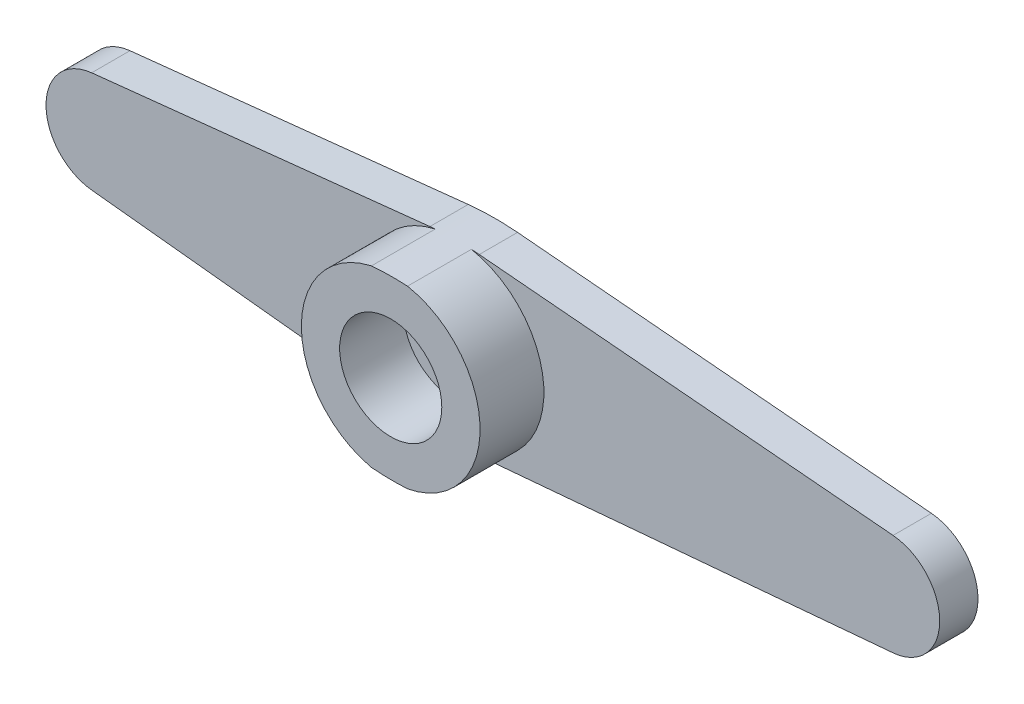
ISO-10303-21;
HEADER;
FILE_DESCRIPTION(('STEP AP214'),'2;1');
FILE_NAME('part.step','',(''),(''),'','','');
FILE_SCHEMA(('AUTOMOTIVE_DESIGN { 1 0 10303 214 1 1 1 1 }'));
ENDSEC;
DATA;
#1=APPLICATION_CONTEXT('core data for automotive mechanical design processes');
#2=APPLICATION_PROTOCOL_DEFINITION('international standard','automotive_design',2000,#1);
#3=PRODUCT_CONTEXT('',#1,'mechanical');
#4=PRODUCT('Part','Part','',(#3));
#5=PRODUCT_RELATED_PRODUCT_CATEGORY('part','',(#4));
#6=PRODUCT_DEFINITION_FORMATION('','',#4);
#7=PRODUCT_DEFINITION_CONTEXT('part definition',#1,'design');
#8=PRODUCT_DEFINITION('design','',#6,#7);
#9=PRODUCT_DEFINITION_SHAPE('','',#8);
#10=(LENGTH_UNIT() NAMED_UNIT(*) SI_UNIT(.MILLI.,.METRE.));
#11=(NAMED_UNIT(*) PLANE_ANGLE_UNIT() SI_UNIT($,.RADIAN.));
#12=(NAMED_UNIT(*) SI_UNIT($,.STERADIAN.) SOLID_ANGLE_UNIT());
#13=UNCERTAINTY_MEASURE_WITH_UNIT(LENGTH_MEASURE(1.E-05),#10,'distance_accuracy_value','');
#14=(GEOMETRIC_REPRESENTATION_CONTEXT(3) GLOBAL_UNCERTAINTY_ASSIGNED_CONTEXT((#13)) GLOBAL_UNIT_ASSIGNED_CONTEXT((#10,
#11,#12)) REPRESENTATION_CONTEXT('',''));
#15=CARTESIAN_POINT('',(0.,0.,0.));
#16=DIRECTION('',(0.,0.,1.));
#17=DIRECTION('',(1.,0.,0.));
#18=AXIS2_PLACEMENT_3D('',#15,#16,#17);
#19=CARTESIAN_POINT('',(0.0923349657358031,6.54656065875096,1.5));
#20=DIRECTION('',(0.,0.,1.));
#21=DIRECTION('',(1.,0.,0.));
#22=AXIS2_PLACEMENT_3D('',#19,#20,#21);
#23=PLANE('',#22);
#24=CARTESIAN_POINT('',(0.0923349657358031,6.54656065875096,1.5));
#25=DIRECTION('',(0.,0.,1.));
#26=DIRECTION('',(1.,0.,0.));
#27=AXIS2_PLACEMENT_3D('',#24,#25,#26);
#28=CIRCLE('',#27,10.);
#29=CARTESIAN_POINT('',(-0.965077795265276,-3.3973760995391,1.5));
#30=VERTEX_POINT('',#29);
#31=CARTESIAN_POINT('',(-0.755897231967521,-3.41739950469708,1.5));
#32=VERTEX_POINT('',#31);
#33=EDGE_CURVE('E270',#30,#32,#28,.T.);
#34=ORIENTED_EDGE('',*,*,#33,.T.);
#35=CARTESIAN_POINT('',(0.,0.,1.5));
#36=DIRECTION('',(0.,0.,1.));
#37=DIRECTION('',(1.,0.,0.));
#38=AXIS2_PLACEMENT_3D('',#35,#36,#37);
#39=CIRCLE('',#38,3.5);
#40=CARTESIAN_POINT('',(-0.755897231967522,3.41739950469708,1.5));
#41=VERTEX_POINT('',#40);
#42=EDGE_CURVE('E162',#32,#41,#39,.F.);
#43=ORIENTED_EDGE('',*,*,#42,.T.);
#44=CARTESIAN_POINT('',(0.0923349657358066,-6.54656065875096,1.5));
#45=DIRECTION('',(0.,0.,1.));
#46=DIRECTION('',(1.,0.,0.));
#47=AXIS2_PLACEMENT_3D('',#44,#45,#46);
#48=CIRCLE('',#47,10.);
#49=CARTESIAN_POINT('',(-0.965077795265283,3.3973760995391,1.5));
#50=VERTEX_POINT('',#49);
#51=EDGE_CURVE('E131',#41,#50,#48,.T.);
#52=ORIENTED_EDGE('',*,*,#51,.T.);
#53=DIRECTION('',(-0.994393675829005,-0.105741276100109,0.));
#54=VECTOR('',#53,1.);
#55=CARTESIAN_POINT('',(-0.965077795265282,3.39737609953909,1.5));
#56=LINE('',#55,#54);
#57=CARTESIAN_POINT('',(-14.2114825522002,1.988787351658,1.5));
#58=VERTEX_POINT('',#57);
#59=EDGE_CURVE('E122',#50,#58,#56,.T.);
#60=ORIENTED_EDGE('',*,*,#59,.T.);
#61=CARTESIAN_POINT('',(-14.,0.,1.5));
#62=DIRECTION('',(0.,0.,1.));
#63=DIRECTION('',(1.,0.,0.));
#64=AXIS2_PLACEMENT_3D('',#61,#62,#63);
#65=CIRCLE('',#64,2.);
#66=CARTESIAN_POINT('',(-14.2114825522002,-1.98878735165802,1.5));
#67=VERTEX_POINT('',#66);
#68=EDGE_CURVE('E127',#58,#67,#65,.T.);
#69=ORIENTED_EDGE('',*,*,#68,.T.);
#70=DIRECTION('',(-0.994393675829005,0.105741276100108,0.));
#71=VECTOR('',#70,1.);
#72=CARTESIAN_POINT('',(-0.965077795265276,-3.3973760995391,1.5));
#73=LINE('',#72,#71);
#74=EDGE_CURVE('E152',#30,#67,#73,.T.);
#75=ORIENTED_EDGE('',*,*,#74,.F.);
#76=EDGE_LOOP('',(#34,#43,#52,#60,#69,#75));
#77=FACE_BOUND('',#76,.T.);
#78=ADVANCED_FACE('F41',(#77),#23,.T.);
#79=CARTESIAN_POINT('',(0.0923349657358031,6.54656065875096,1.5));
#80=DIRECTION('',(0.,0.,-1.));
#81=DIRECTION('',(-1.,0.,0.));
#82=AXIS2_PLACEMENT_3D('',#79,#80,#81);
#83=CYLINDRICAL_SURFACE('',#82,10.);
#84=CARTESIAN_POINT('',(0.0923349657358031,6.54656065875096,0.));
#85=DIRECTION('',(0.,0.,1.));
#86=DIRECTION('',(1.,0.,0.));
#87=AXIS2_PLACEMENT_3D('',#84,#85,#86);
#88=CIRCLE('',#87,10.);
#89=CARTESIAN_POINT('',(-0.965077795265276,-3.3973760995391,0.));
#90=VERTEX_POINT('',#89);
#91=CARTESIAN_POINT('',(0.966800983112841,-3.41513142565181,0.));
#92=VERTEX_POINT('',#91);
#93=EDGE_CURVE('E158',#90,#92,#88,.T.);
#94=ORIENTED_EDGE('',*,*,#93,.T.);
#95=DIRECTION('',(0.,0.,-1.));
#96=VECTOR('',#95,1.);
#97=CARTESIAN_POINT('',(0.966800983112841,-3.41513142565181,1.5));
#98=LINE('',#97,#96);
#99=CARTESIAN_POINT('',(0.966800983112841,-3.41513142565181,1.5));
#100=VERTEX_POINT('',#99);
#101=EDGE_CURVE('E45',#100,#92,#98,.T.);
#102=ORIENTED_EDGE('',*,*,#101,.F.);
#103=CARTESIAN_POINT('',(0.659215340358419,-3.43735874401205,1.5));
#104=VERTEX_POINT('',#103);
#105=EDGE_CURVE('E105',#104,#100,#28,.T.);
#106=ORIENTED_EDGE('',*,*,#105,.F.);
#107=DIRECTION('',(0.,0.,-1.));
#108=VECTOR('',#107,1.);
#109=CARTESIAN_POINT('',(0.659215340358419,-3.43735874401205,4.));
#110=LINE('',#109,#108);
#111=CARTESIAN_POINT('',(0.659215340358419,-3.43735874401205,4.));
#112=VERTEX_POINT('',#111);
#113=EDGE_CURVE('E58',#112,#104,#110,.T.);
#114=ORIENTED_EDGE('',*,*,#113,.F.);
#115=CARTESIAN_POINT('',(0.0923349657358031,6.54656065875096,4.));
#116=DIRECTION('',(0.,0.,1.));
#117=DIRECTION('',(1.,0.,0.));
#118=AXIS2_PLACEMENT_3D('',#115,#116,#117);
#119=CIRCLE('',#118,10.);
#120=CARTESIAN_POINT('',(-0.755897231967521,-3.41739950469708,4.));
#121=VERTEX_POINT('',#120);
#122=EDGE_CURVE('E254',#121,#112,#119,.T.);
#123=ORIENTED_EDGE('',*,*,#122,.F.);
#124=DIRECTION('',(0.,0.,-1.));
#125=VECTOR('',#124,1.);
#126=CARTESIAN_POINT('',(-0.755897231967521,-3.41739950469708,4.));
#127=LINE('',#126,#125);
#128=EDGE_CURVE('E251',#121,#32,#127,.T.);
#129=ORIENTED_EDGE('',*,*,#128,.T.);
#130=ORIENTED_EDGE('',*,*,#33,.F.);
#131=DIRECTION('',(0.,0.,-1.));
#132=VECTOR('',#131,1.);
#133=CARTESIAN_POINT('',(-0.965077795265276,-3.3973760995391,1.5));
#134=LINE('',#133,#132);
#135=EDGE_CURVE('E67',#30,#90,#134,.T.);
#136=ORIENTED_EDGE('',*,*,#135,.T.);
#137=EDGE_LOOP('',(#94,#102,#106,#114,#123,#129,#130,#136));
#138=FACE_BOUND('',#137,.T.);
#139=ADVANCED_FACE('F43',(#138),#83,.T.);
#140=CARTESIAN_POINT('',(0.966800983112841,-3.41513142565181,1.5));
#141=DIRECTION('',(-0.0874466017377038,0.996169208440277,0.));
#142=DIRECTION('',(-0.996169208440277,-0.0874466017377038,0.));
#143=AXIS2_PLACEMENT_3D('',#140,#141,#142);
#144=PLANE('',#143);
#145=DIRECTION('',(0.996169208440277,0.0874466017377038,0.));
#146=VECTOR('',#145,1.);
#147=CARTESIAN_POINT('',(0.966800983112841,-3.41513142565181,0.));
#148=LINE('',#147,#146);
#149=CARTESIAN_POINT('',(17.1748932034754,-1.99233841688056,0.));
#150=VERTEX_POINT('',#149);
#151=EDGE_CURVE('E161',#92,#150,#148,.T.);
#152=ORIENTED_EDGE('',*,*,#151,.T.);
#153=DIRECTION('',(0.,0.,-1.));
#154=VECTOR('',#153,1.);
#155=CARTESIAN_POINT('',(17.1748932034754,-1.99233841688056,1.5));
#156=LINE('',#155,#154);
#157=CARTESIAN_POINT('',(17.1748932034754,-1.99233841688056,1.5));
#158=VERTEX_POINT('',#157);
#159=EDGE_CURVE('E197',#158,#150,#156,.T.);
#160=ORIENTED_EDGE('',*,*,#159,.F.);
#161=DIRECTION('',(0.996169208440277,0.0874466017377038,0.));
#162=VECTOR('',#161,1.);
#163=CARTESIAN_POINT('',(0.966800983112841,-3.41513142565181,1.5));
#164=LINE('',#163,#162);
#165=EDGE_CURVE('E209',#100,#158,#164,.T.);
#166=ORIENTED_EDGE('',*,*,#165,.F.);
#167=ORIENTED_EDGE('',*,*,#101,.T.);
#168=EDGE_LOOP('',(#152,#160,#166,#167));
#169=FACE_BOUND('',#168,.T.);
#170=ADVANCED_FACE('F207',(#169),#144,.F.);
#171=CARTESIAN_POINT('',(17.,0.,1.5));
#172=DIRECTION('',(0.,0.,-1.));
#173=DIRECTION('',(-1.,0.,0.));
#174=AXIS2_PLACEMENT_3D('',#171,#172,#173);
#175=CYLINDRICAL_SURFACE('',#174,2.);
#176=CARTESIAN_POINT('',(17.,0.,0.));
#177=DIRECTION('',(0.,0.,-1.));
#178=DIRECTION('',(-1.,0.,0.));
#179=AXIS2_PLACEMENT_3D('',#176,#177,#178);
#180=CIRCLE('',#179,2.);
#181=CARTESIAN_POINT('',(17.1748932034754,1.99233841688055,0.));
#182=VERTEX_POINT('',#181);
#183=EDGE_CURVE('E166',#182,#150,#180,.T.);
#184=ORIENTED_EDGE('',*,*,#183,.F.);
#185=DIRECTION('',(0.,0.,-1.));
#186=VECTOR('',#185,1.);
#187=CARTESIAN_POINT('',(17.1748932034754,1.99233841688055,1.5));
#188=LINE('',#187,#186);
#189=CARTESIAN_POINT('',(17.1748932034754,1.99233841688055,1.5));
#190=VERTEX_POINT('',#189);
#191=EDGE_CURVE('E195',#190,#182,#188,.T.);
#192=ORIENTED_EDGE('',*,*,#191,.F.);
#193=CARTESIAN_POINT('',(17.,0.,1.5));
#194=DIRECTION('',(0.,0.,-1.));
#195=DIRECTION('',(-1.,0.,0.));
#196=AXIS2_PLACEMENT_3D('',#193,#194,#195);
#197=CIRCLE('',#196,2.);
#198=EDGE_CURVE('E216',#190,#158,#197,.T.);
#199=ORIENTED_EDGE('',*,*,#198,.T.);
#200=ORIENTED_EDGE('',*,*,#159,.T.);
#201=EDGE_LOOP('',(#184,#192,#199,#200));
#202=FACE_BOUND('',#201,.T.);
#203=ADVANCED_FACE('F214',(#202),#175,.T.);
#204=CARTESIAN_POINT('',(0.966800983112849,3.41513142565181,1.5));
#205=DIRECTION('',(0.0874466017377044,0.996169208440277,0.));
#206=DIRECTION('',(-0.996169208440277,0.0874466017377044,0.));
#207=AXIS2_PLACEMENT_3D('',#204,#205,#206);
#208=PLANE('',#207);
#209=DIRECTION('',(0.996169208440277,-0.0874466017377044,0.));
#210=VECTOR('',#209,1.);
#211=CARTESIAN_POINT('',(0.966800983112849,3.41513142565181,0.));
#212=LINE('',#211,#210);
#213=CARTESIAN_POINT('',(0.966800983112849,3.41513142565181,0.));
#214=VERTEX_POINT('',#213);
#215=EDGE_CURVE('E170',#214,#182,#212,.T.);
#216=ORIENTED_EDGE('',*,*,#215,.F.);
#217=DIRECTION('',(0.,0.,-1.));
#218=VECTOR('',#217,1.);
#219=CARTESIAN_POINT('',(0.966800983112849,3.41513142565181,1.5));
#220=LINE('',#219,#218);
#221=CARTESIAN_POINT('',(0.966800983112849,3.41513142565181,1.5));
#222=VERTEX_POINT('',#221);
#223=EDGE_CURVE('E192',#222,#214,#220,.T.);
#224=ORIENTED_EDGE('',*,*,#223,.F.);
#225=DIRECTION('',(0.996169208440277,-0.0874466017377044,0.));
#226=VECTOR('',#225,1.);
#227=CARTESIAN_POINT('',(0.966800983112849,3.41513142565181,1.5));
#228=LINE('',#227,#226);
#229=EDGE_CURVE('E222',#222,#190,#228,.T.);
#230=ORIENTED_EDGE('',*,*,#229,.T.);
#231=ORIENTED_EDGE('',*,*,#191,.T.);
#232=EDGE_LOOP('',(#216,#224,#230,#231));
#233=FACE_BOUND('',#232,.T.);
#234=ADVANCED_FACE('F225',(#233),#208,.T.);
#235=CARTESIAN_POINT('',(0.0923349657358066,-6.54656065875096,1.5));
#236=DIRECTION('',(0.,0.,-1.));
#237=DIRECTION('',(-1.,0.,0.));
#238=AXIS2_PLACEMENT_3D('',#235,#236,#237);
#239=CYLINDRICAL_SURFACE('',#238,10.);
#240=CARTESIAN_POINT('',(0.0923349657358066,-6.54656065875096,0.));
#241=DIRECTION('',(0.,0.,1.));
#242=DIRECTION('',(1.,0.,0.));
#243=AXIS2_PLACEMENT_3D('',#240,#241,#242);
#244=CIRCLE('',#243,10.);
#245=CARTESIAN_POINT('',(-0.965077795265283,3.3973760995391,0.));
#246=VERTEX_POINT('',#245);
#247=EDGE_CURVE('E174',#214,#246,#244,.T.);
#248=ORIENTED_EDGE('',*,*,#247,.T.);
#249=DIRECTION('',(0.,0.,-1.));
#250=VECTOR('',#249,1.);
#251=CARTESIAN_POINT('',(-0.965077795265283,3.3973760995391,1.5));
#252=LINE('',#251,#250);
#253=EDGE_CURVE('E147',#50,#246,#252,.T.);
#254=ORIENTED_EDGE('',*,*,#253,.F.);
#255=ORIENTED_EDGE('',*,*,#51,.F.);
#256=DIRECTION('',(0.,0.,-1.));
#257=VECTOR('',#256,1.);
#258=CARTESIAN_POINT('',(-0.755897231967522,3.41739950469708,4.));
#259=LINE('',#258,#257);
#260=CARTESIAN_POINT('',(-0.755897231967522,3.41739950469708,4.));
#261=VERTEX_POINT('',#260);
#262=EDGE_CURVE('E262',#261,#41,#259,.T.);
#263=ORIENTED_EDGE('',*,*,#262,.F.);
#264=CARTESIAN_POINT('',(0.0923349657358066,-6.54656065875096,4.));
#265=DIRECTION('',(0.,0.,1.));
#266=DIRECTION('',(1.,0.,0.));
#267=AXIS2_PLACEMENT_3D('',#264,#265,#266);
#268=CIRCLE('',#267,10.);
#269=CARTESIAN_POINT('',(0.659215340358417,3.43735874401205,4.));
#270=VERTEX_POINT('',#269);
#271=EDGE_CURVE('E245',#270,#261,#268,.T.);
#272=ORIENTED_EDGE('',*,*,#271,.F.);
#273=DIRECTION('',(0.,0.,-1.));
#274=VECTOR('',#273,1.);
#275=CARTESIAN_POINT('',(0.659215340358417,3.43735874401205,4.));
#276=LINE('',#275,#274);
#277=CARTESIAN_POINT('',(0.659215340358417,3.43735874401205,1.5));
#278=VERTEX_POINT('',#277);
#279=EDGE_CURVE('E242',#270,#278,#276,.T.);
#280=ORIENTED_EDGE('',*,*,#279,.T.);
#281=EDGE_CURVE('E136',#222,#278,#48,.T.);
#282=ORIENTED_EDGE('',*,*,#281,.F.);
#283=ORIENTED_EDGE('',*,*,#223,.T.);
#284=EDGE_LOOP('',(#248,#254,#255,#263,#272,#280,#282,#283));
#285=FACE_BOUND('',#284,.T.);
#286=ADVANCED_FACE('F239',(#285),#239,.T.);
#287=CARTESIAN_POINT('',(-0.965077795265282,3.39737609953909,1.5));
#288=DIRECTION('',(0.105741276100109,-0.994393675829005,0.));
#289=DIRECTION('',(0.994393675829005,0.105741276100109,0.));
#290=AXIS2_PLACEMENT_3D('',#287,#288,#289);
#291=PLANE('',#290);
#292=DIRECTION('',(-0.994393675829005,-0.105741276100109,0.));
#293=VECTOR('',#292,1.);
#294=CARTESIAN_POINT('',(-0.965077795265282,3.39737609953909,0.));
#295=LINE('',#294,#293);
#296=CARTESIAN_POINT('',(-14.2114825522002,1.988787351658,0.));
#297=VERTEX_POINT('',#296);
#298=EDGE_CURVE('E142',#246,#297,#295,.T.);
#299=ORIENTED_EDGE('',*,*,#298,.T.);
#300=DIRECTION('',(0.,0.,-1.));
#301=VECTOR('',#300,1.);
#302=CARTESIAN_POINT('',(-14.2114825522002,1.988787351658,1.5));
#303=LINE('',#302,#301);
#304=EDGE_CURVE('E139',#58,#297,#303,.T.);
#305=ORIENTED_EDGE('',*,*,#304,.F.);
#306=ORIENTED_EDGE('',*,*,#59,.F.);
#307=ORIENTED_EDGE('',*,*,#253,.T.);
#308=EDGE_LOOP('',(#299,#305,#306,#307));
#309=FACE_BOUND('',#308,.T.);
#310=ADVANCED_FACE('F140',(#309),#291,.F.);
#311=CARTESIAN_POINT('',(-14.,0.,1.5));
#312=DIRECTION('',(0.,0.,-1.));
#313=DIRECTION('',(-1.,0.,0.));
#314=AXIS2_PLACEMENT_3D('',#311,#312,#313);
#315=CYLINDRICAL_SURFACE('',#314,2.);
#316=CARTESIAN_POINT('',(-14.,0.,0.));
#317=DIRECTION('',(0.,0.,1.));
#318=DIRECTION('',(1.,0.,0.));
#319=AXIS2_PLACEMENT_3D('',#316,#317,#318);
#320=CIRCLE('',#319,2.);
#321=CARTESIAN_POINT('',(-14.2114825522002,-1.98878735165802,0.));
#322=VERTEX_POINT('',#321);
#323=EDGE_CURVE('E179',#297,#322,#320,.T.);
#324=ORIENTED_EDGE('',*,*,#323,.T.);
#325=DIRECTION('',(0.,0.,-1.));
#326=VECTOR('',#325,1.);
#327=CARTESIAN_POINT('',(-14.2114825522002,-1.98878735165802,1.5));
#328=LINE('',#327,#326);
#329=EDGE_CURVE('E148',#67,#322,#328,.T.);
#330=ORIENTED_EDGE('',*,*,#329,.F.);
#331=ORIENTED_EDGE('',*,*,#68,.F.);
#332=ORIENTED_EDGE('',*,*,#304,.T.);
#333=EDGE_LOOP('',(#324,#330,#331,#332));
#334=FACE_BOUND('',#333,.T.);
#335=ADVANCED_FACE('F150',(#334),#315,.T.);
#336=CARTESIAN_POINT('',(-0.965077795265276,-3.3973760995391,1.5));
#337=DIRECTION('',(-0.105741276100108,-0.994393675829005,0.));
#338=DIRECTION('',(0.994393675829005,-0.105741276100108,0.));
#339=AXIS2_PLACEMENT_3D('',#336,#337,#338);
#340=PLANE('',#339);
#341=DIRECTION('',(-0.994393675829005,0.105741276100108,0.));
#342=VECTOR('',#341,1.);
#343=CARTESIAN_POINT('',(-0.965077795265276,-3.3973760995391,0.));
#344=LINE('',#343,#342);
#345=EDGE_CURVE('E182',#90,#322,#344,.T.);
#346=ORIENTED_EDGE('',*,*,#345,.F.);
#347=ORIENTED_EDGE('',*,*,#135,.F.);
#348=ORIENTED_EDGE('',*,*,#74,.T.);
#349=ORIENTED_EDGE('',*,*,#329,.T.);
#350=EDGE_LOOP('',(#346,#347,#348,#349));
#351=FACE_BOUND('',#350,.T.);
#352=ADVANCED_FACE('F312',(#351),#340,.T.);
#353=ORIENTED_EDGE('',*,*,#281,.T.);
#354=CARTESIAN_POINT('',(0.,0.,1.5));
#355=DIRECTION('',(0.,0.,1.));
#356=DIRECTION('',(1.,0.,0.));
#357=AXIS2_PLACEMENT_3D('',#354,#355,#356);
#358=CIRCLE('',#357,3.5);
#359=EDGE_CURVE('E233',#278,#104,#358,.F.);
#360=ORIENTED_EDGE('',*,*,#359,.T.);
#361=ORIENTED_EDGE('',*,*,#105,.T.);
#362=ORIENTED_EDGE('',*,*,#165,.T.);
#363=ORIENTED_EDGE('',*,*,#198,.F.);
#364=ORIENTED_EDGE('',*,*,#229,.F.);
#365=EDGE_LOOP('',(#353,#360,#361,#362,#363,#364));
#366=FACE_BOUND('',#365,.T.);
#367=ADVANCED_FACE('F221',(#366),#23,.T.);
#368=CARTESIAN_POINT('',(0.0923349657358031,6.54656065875096,0.));
#369=DIRECTION('',(0.,0.,1.));
#370=DIRECTION('',(1.,0.,0.));
#371=AXIS2_PLACEMENT_3D('',#368,#369,#370);
#372=PLANE('',#371);
#373=ORIENTED_EDGE('',*,*,#151,.F.);
#374=ORIENTED_EDGE('',*,*,#93,.F.);
#375=ORIENTED_EDGE('',*,*,#345,.T.);
#376=ORIENTED_EDGE('',*,*,#323,.F.);
#377=ORIENTED_EDGE('',*,*,#298,.F.);
#378=ORIENTED_EDGE('',*,*,#247,.F.);
#379=ORIENTED_EDGE('',*,*,#215,.T.);
#380=ORIENTED_EDGE('',*,*,#183,.T.);
#381=EDGE_LOOP('',(#373,#374,#375,#376,#377,#378,#379,#380));
#382=FACE_BOUND('',#381,.T.);
#383=ADVANCED_FACE('F211',(#382),#372,.F.);
#384=CARTESIAN_POINT('',(0.,0.,4.));
#385=DIRECTION('',(0.,0.,-1.));
#386=DIRECTION('',(-1.,0.,0.));
#387=AXIS2_PLACEMENT_3D('',#384,#385,#386);
#388=CYLINDRICAL_SURFACE('',#387,3.5);
#389=ORIENTED_EDGE('',*,*,#42,.F.);
#390=ORIENTED_EDGE('',*,*,#128,.F.);
#391=CARTESIAN_POINT('',(0.,0.,4.));
#392=DIRECTION('',(0.,0.,1.));
#393=DIRECTION('',(1.,0.,0.));
#394=AXIS2_PLACEMENT_3D('',#391,#392,#393);
#395=CIRCLE('',#394,3.5);
#396=EDGE_CURVE('E256',#261,#121,#395,.T.);
#397=ORIENTED_EDGE('',*,*,#396,.F.);
#398=ORIENTED_EDGE('',*,*,#262,.T.);
#399=EDGE_LOOP('',(#389,#390,#397,#398));
#400=FACE_BOUND('',#399,.T.);
#401=ADVANCED_FACE('F281',(#400),#388,.T.);
#402=CARTESIAN_POINT('',(0.,0.,4.));
#403=DIRECTION('',(0.,0.,-1.));
#404=DIRECTION('',(-1.,0.,0.));
#405=AXIS2_PLACEMENT_3D('',#402,#403,#404);
#406=CYLINDRICAL_SURFACE('',#405,2.);
#407=CARTESIAN_POINT('',(0.,0.,1.5));
#408=DIRECTION('',(0.,0.,1.));
#409=DIRECTION('',(1.,0.,0.));
#410=AXIS2_PLACEMENT_3D('',#407,#408,#409);
#411=CIRCLE('',#410,2.);
#412=CARTESIAN_POINT('',(2.,0.,1.5));
#413=VERTEX_POINT('',#412);
#414=EDGE_CURVE('E11',#413,#413,#411,.F.);
#415=ORIENTED_EDGE('',*,*,#414,.T.);
#416=EDGE_LOOP('',(#415));
#417=FACE_BOUND('',#416,.T.);
#418=CARTESIAN_POINT('',(0.,0.,4.));
#419=DIRECTION('',(0.,0.,1.));
#420=DIRECTION('',(1.,0.,0.));
#421=AXIS2_PLACEMENT_3D('',#418,#419,#420);
#422=CIRCLE('',#421,2.);
#423=CARTESIAN_POINT('',(2.,0.,4.));
#424=VERTEX_POINT('',#423);
#425=EDGE_CURVE('E321',#424,#424,#422,.T.);
#426=ORIENTED_EDGE('',*,*,#425,.T.);
#427=EDGE_LOOP('',(#426));
#428=FACE_BOUND('',#427,.T.);
#429=ADVANCED_FACE('F293',(#417,#428),#406,.F.);
#430=ORIENTED_EDGE('',*,*,#359,.F.);
#431=ORIENTED_EDGE('',*,*,#279,.F.);
#432=EDGE_CURVE('E247',#112,#270,#395,.T.);
#433=ORIENTED_EDGE('',*,*,#432,.F.);
#434=ORIENTED_EDGE('',*,*,#113,.T.);
#435=EDGE_LOOP('',(#430,#431,#433,#434));
#436=FACE_BOUND('',#435,.T.);
#437=ADVANCED_FACE('F291',(#436),#388,.T.);
#438=CARTESIAN_POINT('',(0.,0.,4.));
#439=DIRECTION('',(0.,0.,1.));
#440=DIRECTION('',(1.,0.,0.));
#441=AXIS2_PLACEMENT_3D('',#438,#439,#440);
#442=PLANE('',#441);
#443=ORIENTED_EDGE('',*,*,#425,.F.);
#444=EDGE_LOOP('',(#443));
#445=FACE_BOUND('',#444,.T.);
#446=ORIENTED_EDGE('',*,*,#271,.T.);
#447=ORIENTED_EDGE('',*,*,#396,.T.);
#448=ORIENTED_EDGE('',*,*,#122,.T.);
#449=ORIENTED_EDGE('',*,*,#432,.T.);
#450=EDGE_LOOP('',(#446,#447,#448,#449));
#451=FACE_BOUND('',#450,.T.);
#452=ADVANCED_FACE('F290',(#445,#451),#442,.T.);
#453=ORIENTED_EDGE('',*,*,#414,.F.);
#454=EDGE_LOOP('',(#453));
#455=FACE_BOUND('',#454,.T.);
#456=ADVANCED_FACE('F299',(#455),#23,.T.);
#457=CLOSED_SHELL('',(#78,#139,#170,#203,#234,#286,#310,#335,#352,#367,#383,#401,#429,#437,#452,#456));
#458=MANIFOLD_SOLID_BREP('B2',#457);
#459=ADVANCED_BREP_SHAPE_REPRESENTATION('',(#18,#458),#14);
#460=SHAPE_DEFINITION_REPRESENTATION(#9,#459);
ENDSEC;
END-ISO-10303-21;
